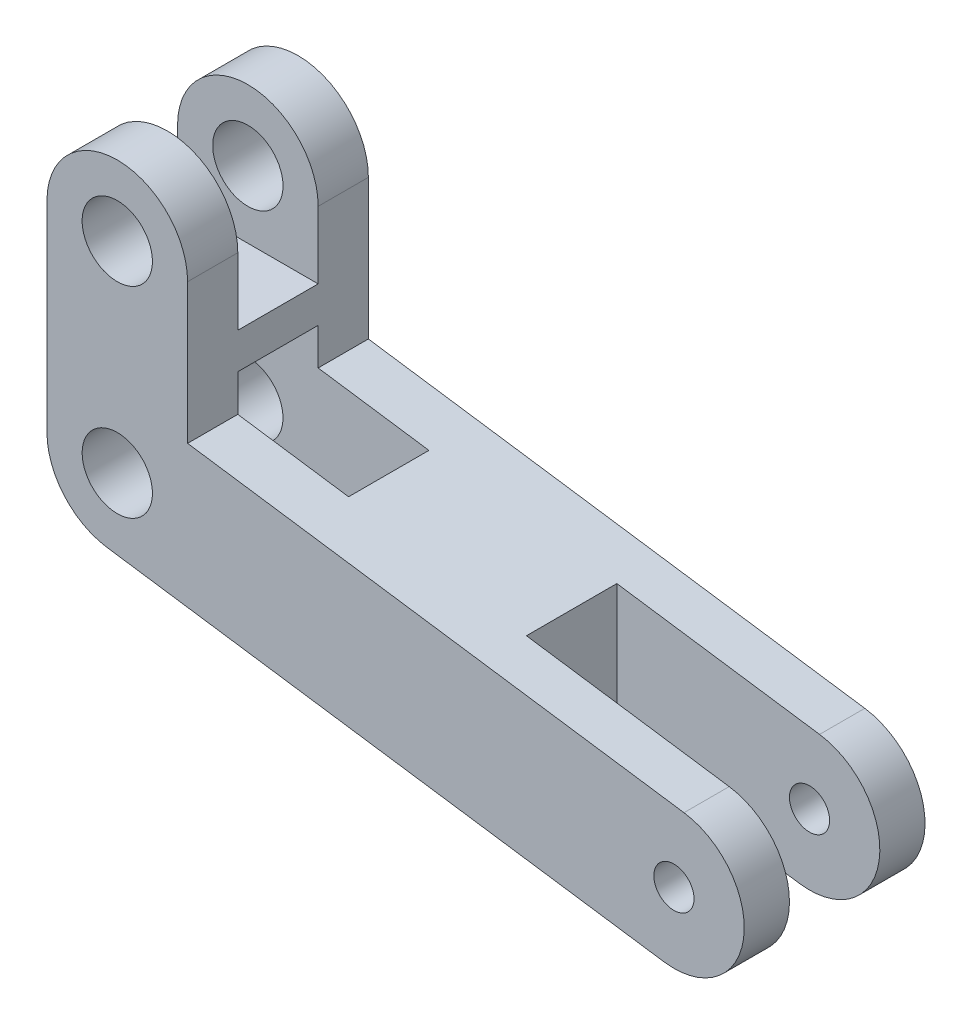
ISO-10303-21;
HEADER;
FILE_DESCRIPTION(('STEP AP214'),'2;1');
FILE_NAME('part.step','',(''),(''),'','','');
FILE_SCHEMA(('AUTOMOTIVE_DESIGN { 1 0 10303 214 1 1 1 1 }'));
ENDSEC;
DATA;
#1=APPLICATION_CONTEXT('core data for automotive mechanical design processes');
#2=APPLICATION_PROTOCOL_DEFINITION('international standard','automotive_design',2000,#1);
#3=PRODUCT_CONTEXT('',#1,'mechanical');
#4=PRODUCT('Part','Part','',(#3));
#5=PRODUCT_RELATED_PRODUCT_CATEGORY('part','',(#4));
#6=PRODUCT_DEFINITION_FORMATION('','',#4);
#7=PRODUCT_DEFINITION_CONTEXT('part definition',#1,'design');
#8=PRODUCT_DEFINITION('design','',#6,#7);
#9=PRODUCT_DEFINITION_SHAPE('','',#8);
#10=(LENGTH_UNIT() NAMED_UNIT(*) SI_UNIT(.MILLI.,.METRE.));
#11=(NAMED_UNIT(*) PLANE_ANGLE_UNIT() SI_UNIT($,.RADIAN.));
#12=(NAMED_UNIT(*) SI_UNIT($,.STERADIAN.) SOLID_ANGLE_UNIT());
#13=UNCERTAINTY_MEASURE_WITH_UNIT(LENGTH_MEASURE(1.E-05),#10,'distance_accuracy_value','');
#14=(GEOMETRIC_REPRESENTATION_CONTEXT(3) GLOBAL_UNCERTAINTY_ASSIGNED_CONTEXT((#13)) GLOBAL_UNIT_ASSIGNED_CONTEXT((#10,
#11,#12)) REPRESENTATION_CONTEXT('',''));
#15=CARTESIAN_POINT('',(0.,0.,0.));
#16=DIRECTION('',(0.,0.,1.));
#17=DIRECTION('',(1.,0.,0.));
#18=AXIS2_PLACEMENT_3D('',#15,#16,#17);
#19=CARTESIAN_POINT('',(27.712812921102,-4.,4.5));
#20=DIRECTION('',(0.,0.,-1.));
#21=DIRECTION('',(-1.,0.,0.));
#22=AXIS2_PLACEMENT_3D('',#19,#20,#21);
#23=CYLINDRICAL_SURFACE('',#22,3.5);
#24=CARTESIAN_POINT('',(27.712812921102,-4.,-2.25));
#25=DIRECTION('',(0.,0.,1.));
#26=DIRECTION('',(1.,0.,0.));
#27=AXIS2_PLACEMENT_3D('',#24,#25,#26);
#28=CIRCLE('',#27,3.5);
#29=CARTESIAN_POINT('',(27.212812921102,-7.46410161513776,-2.25));
#30=VERTEX_POINT('',#29);
#31=CARTESIAN_POINT('',(28.212812921102,-0.535898384862245,-2.25));
#32=VERTEX_POINT('',#31);
#33=EDGE_CURVE('E219',#30,#32,#28,.T.);
#34=ORIENTED_EDGE('',*,*,#33,.F.);
#35=DIRECTION('',(0.,0.,-1.));
#36=VECTOR('',#35,1.);
#37=CARTESIAN_POINT('',(27.212812921102,-7.46410161513776,4.5));
#38=LINE('',#37,#36);
#39=CARTESIAN_POINT('',(27.212812921102,-7.46410161513776,-4.5));
#40=VERTEX_POINT('',#39);
#41=EDGE_CURVE('E323',#30,#40,#38,.T.);
#42=ORIENTED_EDGE('',*,*,#41,.T.);
#43=CARTESIAN_POINT('',(27.712812921102,-4.,-4.5));
#44=DIRECTION('',(0.,0.,1.));
#45=DIRECTION('',(1.,0.,0.));
#46=AXIS2_PLACEMENT_3D('',#43,#44,#45);
#47=CIRCLE('',#46,3.5);
#48=CARTESIAN_POINT('',(28.212812921102,-0.535898384862245,-4.5));
#49=VERTEX_POINT('',#48);
#50=EDGE_CURVE('E304',#40,#49,#47,.T.);
#51=ORIENTED_EDGE('',*,*,#50,.T.);
#52=DIRECTION('',(0.,0.,-1.));
#53=VECTOR('',#52,1.);
#54=CARTESIAN_POINT('',(28.212812921102,-0.535898384862245,4.5));
#55=LINE('',#54,#53);
#56=EDGE_CURVE('E366',#32,#49,#55,.T.);
#57=ORIENTED_EDGE('',*,*,#56,.F.);
#58=EDGE_LOOP('',(#34,#42,#51,#57));
#59=FACE_BOUND('',#58,.T.);
#60=ADVANCED_FACE('F41',(#59),#23,.T.);
#61=CARTESIAN_POINT('',(28.212812921102,-0.535898384862245,4.5));
#62=DIRECTION('',(-0.142857142857143,-0.989743318610787,0.));
#63=DIRECTION('',(0.989743318610787,-0.142857142857143,0.));
#64=AXIS2_PLACEMENT_3D('',#61,#62,#63);
#65=PLANE('',#64);
#66=DIRECTION('',(-0.989743318610787,0.142857142857143,0.));
#67=VECTOR('',#66,1.);
#68=CARTESIAN_POINT('',(28.212812921102,-0.535898384862245,-2.25));
#69=LINE('',#68,#67);
#70=CARTESIAN_POINT('',(18.1194036640366,0.920959753039698,-2.25));
#71=VERTEX_POINT('',#70);
#72=EDGE_CURVE('E201',#32,#71,#69,.T.);
#73=ORIENTED_EDGE('',*,*,#72,.F.);
#74=ORIENTED_EDGE('',*,*,#56,.T.);
#75=DIRECTION('',(-0.989743318610787,0.142857142857143,0.));
#76=VECTOR('',#75,1.);
#77=CARTESIAN_POINT('',(28.212812921102,-0.535898384862245,-4.5));
#78=LINE('',#77,#76);
#79=CARTESIAN_POINT('',(3.5,3.03108891324554,-4.5));
#80=VERTEX_POINT('',#79);
#81=EDGE_CURVE('E326',#49,#80,#78,.T.);
#82=ORIENTED_EDGE('',*,*,#81,.T.);
#83=DIRECTION('',(0.,0.,-1.));
#84=VECTOR('',#83,1.);
#85=CARTESIAN_POINT('',(3.5,3.03108891324554,4.5));
#86=LINE('',#85,#84);
#87=CARTESIAN_POINT('',(3.5,3.03108891324554,-2.));
#88=VERTEX_POINT('',#87);
#89=EDGE_CURVE('E362',#88,#80,#86,.T.);
#90=ORIENTED_EDGE('',*,*,#89,.F.);
#91=DIRECTION('',(0.989743318610787,-0.142857142857143,0.));
#92=VECTOR('',#91,1.);
#93=CARTESIAN_POINT('',(28.212812921102,-0.535898384862245,-2.));
#94=LINE('',#93,#92);
#95=CARTESIAN_POINT('',(9.01483292771079,2.23509134440813,-2.));
#96=VERTEX_POINT('',#95);
#97=EDGE_CURVE('E279',#88,#96,#94,.T.);
#98=ORIENTED_EDGE('',*,*,#97,.T.);
#99=DIRECTION('',(0.,0.,1.));
#100=VECTOR('',#99,1.);
#101=CARTESIAN_POINT('',(9.01483292771079,2.23509134440813,4.5));
#102=LINE('',#101,#100);
#103=CARTESIAN_POINT('',(9.01483292771079,2.23509134440813,2.));
#104=VERTEX_POINT('',#103);
#105=EDGE_CURVE('E282',#96,#104,#102,.T.);
#106=ORIENTED_EDGE('',*,*,#105,.T.);
#107=DIRECTION('',(0.989743318610787,-0.142857142857143,0.));
#108=VECTOR('',#107,1.);
#109=CARTESIAN_POINT('',(28.212812921102,-0.535898384862245,2.));
#110=LINE('',#109,#108);
#111=CARTESIAN_POINT('',(3.5,3.03108891324554,2.));
#112=VERTEX_POINT('',#111);
#113=EDGE_CURVE('E264',#112,#104,#110,.T.);
#114=ORIENTED_EDGE('',*,*,#113,.F.);
#115=CARTESIAN_POINT('',(3.5,3.03108891324554,4.5));
#116=VERTEX_POINT('',#115);
#117=EDGE_CURVE('E363',#116,#112,#86,.T.);
#118=ORIENTED_EDGE('',*,*,#117,.F.);
#119=DIRECTION('',(-0.989743318610787,0.142857142857143,0.));
#120=VECTOR('',#119,1.);
#121=CARTESIAN_POINT('',(28.212812921102,-0.535898384862245,4.5));
#122=LINE('',#121,#120);
#123=CARTESIAN_POINT('',(28.212812921102,-0.535898384862245,4.5));
#124=VERTEX_POINT('',#123);
#125=EDGE_CURVE('E310',#124,#116,#122,.T.);
#126=ORIENTED_EDGE('',*,*,#125,.F.);
#127=CARTESIAN_POINT('',(28.212812921102,-0.535898384862245,2.25));
#128=VERTEX_POINT('',#127);
#129=EDGE_CURVE('E210',#124,#128,#55,.T.);
#130=ORIENTED_EDGE('',*,*,#129,.T.);
#131=DIRECTION('',(-0.989743318610787,0.142857142857143,0.));
#132=VECTOR('',#131,1.);
#133=CARTESIAN_POINT('',(28.212812921102,-0.535898384862245,2.25));
#134=LINE('',#133,#132);
#135=CARTESIAN_POINT('',(18.1194036640366,0.920959753039698,2.25));
#136=VERTEX_POINT('',#135);
#137=EDGE_CURVE('E204',#128,#136,#134,.T.);
#138=ORIENTED_EDGE('',*,*,#137,.T.);
#139=DIRECTION('',(0.,0.,-1.));
#140=VECTOR('',#139,1.);
#141=CARTESIAN_POINT('',(18.1194036640366,0.920959753039699,4.5));
#142=LINE('',#141,#140);
#143=EDGE_CURVE('E191',#136,#71,#142,.T.);
#144=ORIENTED_EDGE('',*,*,#143,.T.);
#145=EDGE_LOOP('',(#73,#74,#82,#90,#98,#106,#114,#118,#126,#130,#138,#144));
#146=FACE_BOUND('',#145,.T.);
#147=ADVANCED_FACE('F208',(#146),#65,.F.);
#148=CARTESIAN_POINT('',(27.212812921102,-7.46410161513776,4.5));
#149=DIRECTION('',(0.142857142857143,0.989743318610787,0.));
#150=DIRECTION('',(-0.989743318610787,0.142857142857143,0.));
#151=AXIS2_PLACEMENT_3D('',#148,#149,#150);
#152=PLANE('',#151);
#153=DIRECTION('',(0.989743318610787,-0.142857142857143,0.));
#154=VECTOR('',#153,1.);
#155=CARTESIAN_POINT('',(27.212812921102,-7.46410161513776,-2.25));
#156=LINE('',#155,#154);
#157=CARTESIAN_POINT('',(18.1194036640366,-6.15158104453322,-2.25));
#158=VERTEX_POINT('',#157);
#159=EDGE_CURVE('E214',#158,#30,#156,.T.);
#160=ORIENTED_EDGE('',*,*,#159,.F.);
#161=DIRECTION('',(0.,0.,1.));
#162=VECTOR('',#161,1.);
#163=CARTESIAN_POINT('',(18.1194036640366,-6.15158104453322,4.5));
#164=LINE('',#163,#162);
#165=CARTESIAN_POINT('',(18.1194036640366,-6.15158104453322,2.25));
#166=VERTEX_POINT('',#165);
#167=EDGE_CURVE('E11',#158,#166,#164,.T.);
#168=ORIENTED_EDGE('',*,*,#167,.T.);
#169=DIRECTION('',(0.989743318610787,-0.142857142857143,0.));
#170=VECTOR('',#169,1.);
#171=CARTESIAN_POINT('',(27.212812921102,-7.46410161513776,2.25));
#172=LINE('',#171,#170);
#173=CARTESIAN_POINT('',(27.212812921102,-7.46410161513776,2.25));
#174=VERTEX_POINT('',#173);
#175=EDGE_CURVE('E205',#166,#174,#172,.T.);
#176=ORIENTED_EDGE('',*,*,#175,.T.);
#177=CARTESIAN_POINT('',(27.212812921102,-7.46410161513776,4.5));
#178=VERTEX_POINT('',#177);
#179=EDGE_CURVE('E343',#178,#174,#38,.T.);
#180=ORIENTED_EDGE('',*,*,#179,.F.);
#181=DIRECTION('',(0.989743318610787,-0.142857142857143,0.));
#182=VECTOR('',#181,1.);
#183=CARTESIAN_POINT('',(27.212812921102,-7.46410161513776,4.5));
#184=LINE('',#183,#182);
#185=CARTESIAN_POINT('',(-0.5,-3.46410161513775,4.5));
#186=VERTEX_POINT('',#185);
#187=EDGE_CURVE('E321',#186,#178,#184,.T.);
#188=ORIENTED_EDGE('',*,*,#187,.F.);
#189=DIRECTION('',(0.,0.,-1.));
#190=VECTOR('',#189,1.);
#191=CARTESIAN_POINT('',(-0.5,-3.46410161513775,4.5));
#192=LINE('',#191,#190);
#193=CARTESIAN_POINT('',(-0.5,-3.46410161513775,2.));
#194=VERTEX_POINT('',#193);
#195=EDGE_CURVE('E347',#186,#194,#192,.T.);
#196=ORIENTED_EDGE('',*,*,#195,.T.);
#197=DIRECTION('',(-0.989743318610787,0.142857142857143,0.));
#198=VECTOR('',#197,1.);
#199=CARTESIAN_POINT('',(27.212812921102,-7.46410161513776,2.));
#200=LINE('',#199,#198);
#201=CARTESIAN_POINT('',(9.01483292771079,-4.83744945316479,2.));
#202=VERTEX_POINT('',#201);
#203=EDGE_CURVE('E256',#202,#194,#200,.T.);
#204=ORIENTED_EDGE('',*,*,#203,.F.);
#205=DIRECTION('',(0.,0.,-1.));
#206=VECTOR('',#205,1.);
#207=CARTESIAN_POINT('',(9.01483292771079,-4.83744945316479,4.5));
#208=LINE('',#207,#206);
#209=CARTESIAN_POINT('',(9.01483292771079,-4.83744945316479,-2.));
#210=VERTEX_POINT('',#209);
#211=EDGE_CURVE('E368',#202,#210,#208,.T.);
#212=ORIENTED_EDGE('',*,*,#211,.T.);
#213=DIRECTION('',(-0.989743318610787,0.142857142857143,0.));
#214=VECTOR('',#213,1.);
#215=CARTESIAN_POINT('',(27.212812921102,-7.46410161513776,-2.));
#216=LINE('',#215,#214);
#217=CARTESIAN_POINT('',(-0.5,-3.46410161513775,-2.));
#218=VERTEX_POINT('',#217);
#219=EDGE_CURVE('E267',#210,#218,#216,.T.);
#220=ORIENTED_EDGE('',*,*,#219,.T.);
#221=CARTESIAN_POINT('',(-0.5,-3.46410161513775,-4.5));
#222=VERTEX_POINT('',#221);
#223=EDGE_CURVE('E346',#218,#222,#192,.T.);
#224=ORIENTED_EDGE('',*,*,#223,.T.);
#225=DIRECTION('',(0.989743318610787,-0.142857142857143,0.));
#226=VECTOR('',#225,1.);
#227=CARTESIAN_POINT('',(27.212812921102,-7.46410161513776,-4.5));
#228=LINE('',#227,#226);
#229=EDGE_CURVE('E311',#222,#40,#228,.T.);
#230=ORIENTED_EDGE('',*,*,#229,.T.);
#231=ORIENTED_EDGE('',*,*,#41,.F.);
#232=EDGE_LOOP('',(#160,#168,#176,#180,#188,#196,#204,#212,#220,#224,#230,#231));
#233=FACE_BOUND('',#232,.T.);
#234=ADVANCED_FACE('F395',(#233),#152,.F.);
#235=CARTESIAN_POINT('',(27.712812921102,-4.,4.5));
#236=DIRECTION('',(0.,0.,-1.));
#237=DIRECTION('',(-1.,0.,0.));
#238=AXIS2_PLACEMENT_3D('',#235,#236,#237);
#239=CYLINDRICAL_SURFACE('',#238,0.999999999999998);
#240=CARTESIAN_POINT('',(27.712812921102,-4.,-4.5));
#241=DIRECTION('',(0.,0.,1.));
#242=DIRECTION('',(1.,0.,0.));
#243=AXIS2_PLACEMENT_3D('',#240,#241,#242);
#244=CIRCLE('',#243,0.999999999999998);
#245=CARTESIAN_POINT('',(28.712812921102,-4.,-4.5));
#246=VERTEX_POINT('',#245);
#247=EDGE_CURVE('E292',#246,#246,#244,.T.);
#248=ORIENTED_EDGE('',*,*,#247,.F.);
#249=EDGE_LOOP('',(#248));
#250=FACE_BOUND('',#249,.T.);
#251=CARTESIAN_POINT('',(27.712812921102,-4.,-2.25));
#252=DIRECTION('',(0.,0.,1.));
#253=DIRECTION('',(1.,0.,0.));
#254=AXIS2_PLACEMENT_3D('',#251,#252,#253);
#255=CIRCLE('',#254,0.999999999999998);
#256=CARTESIAN_POINT('',(28.712812921102,-4.,-2.25));
#257=VERTEX_POINT('',#256);
#258=EDGE_CURVE('E211',#257,#257,#255,.T.);
#259=ORIENTED_EDGE('',*,*,#258,.T.);
#260=EDGE_LOOP('',(#259));
#261=FACE_BOUND('',#260,.T.);
#262=ADVANCED_FACE('F470',(#250,#261),#239,.F.);
#263=CARTESIAN_POINT('',(3.5,10.,4.5));
#264=DIRECTION('',(-1.,0.,0.));
#265=DIRECTION('',(0.,-1.,0.));
#266=AXIS2_PLACEMENT_3D('',#263,#264,#265);
#267=PLANE('',#266);
#268=DIRECTION('',(0.,1.,0.));
#269=VECTOR('',#268,1.);
#270=CARTESIAN_POINT('',(3.5,16.4698635435501,-2.));
#271=LINE('',#270,#269);
#272=CARTESIAN_POINT('',(3.5,6.65669603838257,-2.));
#273=VERTEX_POINT('',#272);
#274=CARTESIAN_POINT('',(3.5,10.,-2.));
#275=VERTEX_POINT('',#274);
#276=EDGE_CURVE('E224',#273,#275,#271,.T.);
#277=ORIENTED_EDGE('',*,*,#276,.F.);
#278=DIRECTION('',(0.,0.,1.));
#279=VECTOR('',#278,1.);
#280=CARTESIAN_POINT('',(3.5,6.65669603838257,-2.));
#281=LINE('',#280,#279);
#282=CARTESIAN_POINT('',(3.5,6.65669603838257,2.));
#283=VERTEX_POINT('',#282);
#284=EDGE_CURVE('E227',#273,#283,#281,.T.);
#285=ORIENTED_EDGE('',*,*,#284,.T.);
#286=DIRECTION('',(0.,1.,0.));
#287=VECTOR('',#286,1.);
#288=CARTESIAN_POINT('',(3.5,16.4698635435501,2.));
#289=LINE('',#288,#287);
#290=CARTESIAN_POINT('',(3.5,10.,2.));
#291=VERTEX_POINT('',#290);
#292=EDGE_CURVE('E225',#283,#291,#289,.T.);
#293=ORIENTED_EDGE('',*,*,#292,.T.);
#294=DIRECTION('',(0.,0.,-1.));
#295=VECTOR('',#294,1.);
#296=CARTESIAN_POINT('',(3.5,10.,4.5));
#297=LINE('',#296,#295);
#298=CARTESIAN_POINT('',(3.5,10.,4.5));
#299=VERTEX_POINT('',#298);
#300=EDGE_CURVE('E359',#299,#291,#297,.T.);
#301=ORIENTED_EDGE('',*,*,#300,.F.);
#302=DIRECTION('',(0.,1.,0.));
#303=VECTOR('',#302,1.);
#304=CARTESIAN_POINT('',(3.5,10.,4.5));
#305=LINE('',#304,#303);
#306=EDGE_CURVE('E313',#116,#299,#305,.T.);
#307=ORIENTED_EDGE('',*,*,#306,.F.);
#308=ORIENTED_EDGE('',*,*,#117,.T.);
#309=DIRECTION('',(0.,-1.,0.));
#310=VECTOR('',#309,1.);
#311=CARTESIAN_POINT('',(3.5,10.,2.));
#312=LINE('',#311,#310);
#313=CARTESIAN_POINT('',(3.5,4.86934920884361,2.));
#314=VERTEX_POINT('',#313);
#315=EDGE_CURVE('E262',#314,#112,#312,.T.);
#316=ORIENTED_EDGE('',*,*,#315,.F.);
#317=DIRECTION('',(0.,0.,-1.));
#318=VECTOR('',#317,1.);
#319=CARTESIAN_POINT('',(3.5,4.86934920884361,4.5));
#320=LINE('',#319,#318);
#321=CARTESIAN_POINT('',(3.5,4.86934920884361,-2.));
#322=VERTEX_POINT('',#321);
#323=EDGE_CURVE('E285',#314,#322,#320,.T.);
#324=ORIENTED_EDGE('',*,*,#323,.T.);
#325=DIRECTION('',(0.,-1.,0.));
#326=VECTOR('',#325,1.);
#327=CARTESIAN_POINT('',(3.5,10.,-2.));
#328=LINE('',#327,#326);
#329=EDGE_CURVE('E276',#322,#88,#328,.T.);
#330=ORIENTED_EDGE('',*,*,#329,.T.);
#331=ORIENTED_EDGE('',*,*,#89,.T.);
#332=DIRECTION('',(0.,1.,0.));
#333=VECTOR('',#332,1.);
#334=CARTESIAN_POINT('',(3.5,10.,-4.5));
#335=LINE('',#334,#333);
#336=CARTESIAN_POINT('',(3.5,10.,-4.5));
#337=VERTEX_POINT('',#336);
#338=EDGE_CURVE('E329',#80,#337,#335,.T.);
#339=ORIENTED_EDGE('',*,*,#338,.T.);
#340=EDGE_CURVE('E358',#275,#337,#297,.T.);
#341=ORIENTED_EDGE('',*,*,#340,.F.);
#342=EDGE_LOOP('',(#277,#285,#293,#301,#307,#308,#316,#324,#330,#331,#339,#341));
#343=FACE_BOUND('',#342,.T.);
#344=ADVANCED_FACE('F411',(#343),#267,.F.);
#345=CARTESIAN_POINT('',(0.,10.,4.5));
#346=DIRECTION('',(0.,0.,-1.));
#347=DIRECTION('',(-1.,0.,0.));
#348=AXIS2_PLACEMENT_3D('',#345,#346,#347);
#349=CYLINDRICAL_SURFACE('',#348,3.5);
#350=CARTESIAN_POINT('',(0.,10.,-2.));
#351=DIRECTION('',(0.,0.,1.));
#352=DIRECTION('',(1.,0.,0.));
#353=AXIS2_PLACEMENT_3D('',#350,#351,#352);
#354=CIRCLE('',#353,3.5);
#355=CARTESIAN_POINT('',(-3.5,10.,-2.));
#356=VERTEX_POINT('',#355);
#357=EDGE_CURVE('E253',#275,#356,#354,.T.);
#358=ORIENTED_EDGE('',*,*,#357,.F.);
#359=ORIENTED_EDGE('',*,*,#340,.T.);
#360=CARTESIAN_POINT('',(0.,10.,-4.5));
#361=DIRECTION('',(0.,0.,1.));
#362=DIRECTION('',(1.,0.,0.));
#363=AXIS2_PLACEMENT_3D('',#360,#361,#362);
#364=CIRCLE('',#363,3.5);
#365=CARTESIAN_POINT('',(-3.5,10.,-4.5));
#366=VERTEX_POINT('',#365);
#367=EDGE_CURVE('E332',#337,#366,#364,.T.);
#368=ORIENTED_EDGE('',*,*,#367,.T.);
#369=DIRECTION('',(0.,0.,-1.));
#370=VECTOR('',#369,1.);
#371=CARTESIAN_POINT('',(-3.5,10.,4.5));
#372=LINE('',#371,#370);
#373=EDGE_CURVE('E354',#356,#366,#372,.T.);
#374=ORIENTED_EDGE('',*,*,#373,.F.);
#375=EDGE_LOOP('',(#358,#359,#368,#374));
#376=FACE_BOUND('',#375,.T.);
#377=ADVANCED_FACE('F459',(#376),#349,.T.);
#378=CARTESIAN_POINT('',(-3.5,10.,4.5));
#379=DIRECTION('',(1.,0.,0.));
#380=DIRECTION('',(0.,1.,0.));
#381=AXIS2_PLACEMENT_3D('',#378,#379,#380);
#382=PLANE('',#381);
#383=DIRECTION('',(0.,-1.,0.));
#384=VECTOR('',#383,1.);
#385=CARTESIAN_POINT('',(-3.5,10.,-2.));
#386=LINE('',#385,#384);
#387=CARTESIAN_POINT('',(-3.5,6.65669603838257,-2.));
#388=VERTEX_POINT('',#387);
#389=EDGE_CURVE('E251',#356,#388,#386,.T.);
#390=ORIENTED_EDGE('',*,*,#389,.F.);
#391=ORIENTED_EDGE('',*,*,#373,.T.);
#392=DIRECTION('',(0.,-1.,0.));
#393=VECTOR('',#392,1.);
#394=CARTESIAN_POINT('',(-3.5,10.,-4.5));
#395=LINE('',#394,#393);
#396=CARTESIAN_POINT('',(-3.5,0.,-4.5));
#397=VERTEX_POINT('',#396);
#398=EDGE_CURVE('E335',#366,#397,#395,.T.);
#399=ORIENTED_EDGE('',*,*,#398,.T.);
#400=DIRECTION('',(0.,0.,-1.));
#401=VECTOR('',#400,1.);
#402=CARTESIAN_POINT('',(-3.5,0.,4.5));
#403=LINE('',#402,#401);
#404=CARTESIAN_POINT('',(-3.5,0.,-2.));
#405=VERTEX_POINT('',#404);
#406=EDGE_CURVE('E350',#405,#397,#403,.T.);
#407=ORIENTED_EDGE('',*,*,#406,.F.);
#408=DIRECTION('',(0.,1.,0.));
#409=VECTOR('',#408,1.);
#410=CARTESIAN_POINT('',(-3.5,10.,-2.));
#411=LINE('',#410,#409);
#412=CARTESIAN_POINT('',(-3.5,4.86934920884361,-2.));
#413=VERTEX_POINT('',#412);
#414=EDGE_CURVE('E273',#405,#413,#411,.T.);
#415=ORIENTED_EDGE('',*,*,#414,.T.);
#416=DIRECTION('',(0.,0.,1.));
#417=VECTOR('',#416,1.);
#418=CARTESIAN_POINT('',(-3.5,4.86934920884361,4.5));
#419=LINE('',#418,#417);
#420=CARTESIAN_POINT('',(-3.5,4.86934920884361,2.));
#421=VERTEX_POINT('',#420);
#422=EDGE_CURVE('E379',#413,#421,#419,.T.);
#423=ORIENTED_EDGE('',*,*,#422,.T.);
#424=DIRECTION('',(0.,1.,0.));
#425=VECTOR('',#424,1.);
#426=CARTESIAN_POINT('',(-3.5,10.,2.));
#427=LINE('',#426,#425);
#428=CARTESIAN_POINT('',(-3.5,0.,2.));
#429=VERTEX_POINT('',#428);
#430=EDGE_CURVE('E260',#429,#421,#427,.T.);
#431=ORIENTED_EDGE('',*,*,#430,.F.);
#432=CARTESIAN_POINT('',(-3.5,0.,4.5));
#433=VERTEX_POINT('',#432);
#434=EDGE_CURVE('E351',#433,#429,#403,.T.);
#435=ORIENTED_EDGE('',*,*,#434,.F.);
#436=DIRECTION('',(0.,-1.,0.));
#437=VECTOR('',#436,1.);
#438=CARTESIAN_POINT('',(-3.5,10.,4.5));
#439=LINE('',#438,#437);
#440=CARTESIAN_POINT('',(-3.5,10.,4.5));
#441=VERTEX_POINT('',#440);
#442=EDGE_CURVE('E317',#441,#433,#439,.T.);
#443=ORIENTED_EDGE('',*,*,#442,.F.);
#444=CARTESIAN_POINT('',(-3.5,10.,2.));
#445=VERTEX_POINT('',#444);
#446=EDGE_CURVE('E355',#441,#445,#372,.T.);
#447=ORIENTED_EDGE('',*,*,#446,.T.);
#448=DIRECTION('',(0.,-1.,0.));
#449=VECTOR('',#448,1.);
#450=CARTESIAN_POINT('',(-3.5,10.,2.));
#451=LINE('',#450,#449);
#452=CARTESIAN_POINT('',(-3.5,6.65669603838257,2.));
#453=VERTEX_POINT('',#452);
#454=EDGE_CURVE('E244',#445,#453,#451,.T.);
#455=ORIENTED_EDGE('',*,*,#454,.T.);
#456=DIRECTION('',(0.,0.,-1.));
#457=VECTOR('',#456,1.);
#458=CARTESIAN_POINT('',(-3.5,6.65669603838257,4.5));
#459=LINE('',#458,#457);
#460=EDGE_CURVE('E49',#453,#388,#459,.T.);
#461=ORIENTED_EDGE('',*,*,#460,.T.);
#462=EDGE_LOOP('',(#390,#391,#399,#407,#415,#423,#431,#435,#443,#447,#455,#461));
#463=FACE_BOUND('',#462,.T.);
#464=ADVANCED_FACE('F434',(#463),#382,.F.);
#465=CARTESIAN_POINT('',(0.,0.,4.5));
#466=DIRECTION('',(0.,0.,-1.));
#467=DIRECTION('',(-1.,0.,0.));
#468=AXIS2_PLACEMENT_3D('',#465,#466,#467);
#469=CYLINDRICAL_SURFACE('',#468,3.5);
#470=CARTESIAN_POINT('',(0.,0.,2.));
#471=DIRECTION('',(0.,0.,-1.));
#472=DIRECTION('',(-1.,0.,0.));
#473=AXIS2_PLACEMENT_3D('',#470,#471,#472);
#474=CIRCLE('',#473,3.5);
#475=EDGE_CURVE('E258',#194,#429,#474,.T.);
#476=ORIENTED_EDGE('',*,*,#475,.F.);
#477=ORIENTED_EDGE('',*,*,#195,.F.);
#478=CARTESIAN_POINT('',(0.,0.,4.5));
#479=DIRECTION('',(0.,0.,1.));
#480=DIRECTION('',(1.,0.,0.));
#481=AXIS2_PLACEMENT_3D('',#478,#479,#480);
#482=CIRCLE('',#481,3.5);
#483=EDGE_CURVE('E319',#433,#186,#482,.T.);
#484=ORIENTED_EDGE('',*,*,#483,.F.);
#485=ORIENTED_EDGE('',*,*,#434,.T.);
#486=EDGE_LOOP('',(#476,#477,#484,#485));
#487=FACE_BOUND('',#486,.T.);
#488=ADVANCED_FACE('F428',(#487),#469,.T.);
#489=CARTESIAN_POINT('',(0.,0.,4.5));
#490=DIRECTION('',(0.,0.,-1.));
#491=DIRECTION('',(-1.,0.,0.));
#492=AXIS2_PLACEMENT_3D('',#489,#490,#491);
#493=CYLINDRICAL_SURFACE('',#492,1.75);
#494=CARTESIAN_POINT('',(0.,0.,4.5));
#495=DIRECTION('',(0.,0.,1.));
#496=DIRECTION('',(1.,0.,0.));
#497=AXIS2_PLACEMENT_3D('',#494,#495,#496);
#498=CIRCLE('',#497,1.75);
#499=CARTESIAN_POINT('',(1.75,0.,4.5));
#500=VERTEX_POINT('',#499);
#501=EDGE_CURVE('E301',#500,#500,#498,.T.);
#502=ORIENTED_EDGE('',*,*,#501,.T.);
#503=EDGE_LOOP('',(#502));
#504=FACE_BOUND('',#503,.T.);
#505=CARTESIAN_POINT('',(0.,0.,2.));
#506=DIRECTION('',(0.,0.,-1.));
#507=DIRECTION('',(-1.,0.,0.));
#508=AXIS2_PLACEMENT_3D('',#505,#506,#507);
#509=CIRCLE('',#508,1.75);
#510=CARTESIAN_POINT('',(-1.75,0.,2.));
#511=VERTEX_POINT('',#510);
#512=EDGE_CURVE('E255',#511,#511,#509,.T.);
#513=ORIENTED_EDGE('',*,*,#512,.T.);
#514=EDGE_LOOP('',(#513));
#515=FACE_BOUND('',#514,.T.);
#516=ADVANCED_FACE('F489',(#504,#515),#493,.F.);
#517=CARTESIAN_POINT('',(0.,10.,4.5));
#518=DIRECTION('',(0.,0.,-1.));
#519=DIRECTION('',(-1.,0.,0.));
#520=AXIS2_PLACEMENT_3D('',#517,#518,#519);
#521=CYLINDRICAL_SURFACE('',#520,1.75);
#522=CARTESIAN_POINT('',(0.,10.,-4.5));
#523=DIRECTION('',(0.,0.,1.));
#524=DIRECTION('',(1.,0.,0.));
#525=AXIS2_PLACEMENT_3D('',#522,#523,#524);
#526=CIRCLE('',#525,1.75);
#527=CARTESIAN_POINT('',(1.75,10.,-4.5));
#528=VERTEX_POINT('',#527);
#529=EDGE_CURVE('E288',#528,#528,#526,.T.);
#530=ORIENTED_EDGE('',*,*,#529,.F.);
#531=EDGE_LOOP('',(#530));
#532=FACE_BOUND('',#531,.T.);
#533=CARTESIAN_POINT('',(0.,10.,-2.));
#534=DIRECTION('',(0.,0.,1.));
#535=DIRECTION('',(1.,0.,0.));
#536=AXIS2_PLACEMENT_3D('',#533,#534,#535);
#537=CIRCLE('',#536,1.75);
#538=CARTESIAN_POINT('',(1.75,10.,-2.));
#539=VERTEX_POINT('',#538);
#540=EDGE_CURVE('E250',#539,#539,#537,.T.);
#541=ORIENTED_EDGE('',*,*,#540,.T.);
#542=EDGE_LOOP('',(#541));
#543=FACE_BOUND('',#542,.T.);
#544=ADVANCED_FACE('F483',(#532,#543),#521,.F.);
#545=CARTESIAN_POINT('',(27.712812921102,-4.,4.5));
#546=DIRECTION('',(0.,0.,1.));
#547=DIRECTION('',(1.,0.,0.));
#548=AXIS2_PLACEMENT_3D('',#545,#546,#547);
#549=PLANE('',#548);
#550=CARTESIAN_POINT('',(27.712812921102,-4.,4.5));
#551=DIRECTION('',(0.,0.,1.));
#552=DIRECTION('',(1.,0.,0.));
#553=AXIS2_PLACEMENT_3D('',#550,#551,#552);
#554=CIRCLE('',#553,0.999999999999998);
#555=CARTESIAN_POINT('',(28.712812921102,-4.,4.5));
#556=VERTEX_POINT('',#555);
#557=EDGE_CURVE('E295',#556,#556,#554,.T.);
#558=ORIENTED_EDGE('',*,*,#557,.F.);
#559=EDGE_LOOP('',(#558));
#560=FACE_BOUND('',#559,.T.);
#561=CARTESIAN_POINT('',(27.712812921102,-4.,4.5));
#562=DIRECTION('',(0.,0.,1.));
#563=DIRECTION('',(1.,0.,0.));
#564=AXIS2_PLACEMENT_3D('',#561,#562,#563);
#565=CIRCLE('',#564,3.5);
#566=EDGE_CURVE('E307',#178,#124,#565,.T.);
#567=ORIENTED_EDGE('',*,*,#566,.T.);
#568=ORIENTED_EDGE('',*,*,#125,.T.);
#569=ORIENTED_EDGE('',*,*,#306,.T.);
#570=CARTESIAN_POINT('',(0.,10.,4.5));
#571=DIRECTION('',(0.,0.,1.));
#572=DIRECTION('',(1.,0.,0.));
#573=AXIS2_PLACEMENT_3D('',#570,#571,#572);
#574=CIRCLE('',#573,3.5);
#575=EDGE_CURVE('E315',#299,#441,#574,.T.);
#576=ORIENTED_EDGE('',*,*,#575,.T.);
#577=ORIENTED_EDGE('',*,*,#442,.T.);
#578=ORIENTED_EDGE('',*,*,#483,.T.);
#579=ORIENTED_EDGE('',*,*,#187,.T.);
#580=EDGE_LOOP('',(#567,#568,#569,#576,#577,#578,#579));
#581=FACE_BOUND('',#580,.T.);
#582=ORIENTED_EDGE('',*,*,#501,.F.);
#583=EDGE_LOOP('',(#582));
#584=FACE_BOUND('',#583,.T.);
#585=CARTESIAN_POINT('',(0.,10.,4.5));
#586=DIRECTION('',(0.,0.,1.));
#587=DIRECTION('',(1.,0.,0.));
#588=AXIS2_PLACEMENT_3D('',#585,#586,#587);
#589=CIRCLE('',#588,1.75);
#590=CARTESIAN_POINT('',(1.75,10.,4.5));
#591=VERTEX_POINT('',#590);
#592=EDGE_CURVE('E289',#591,#591,#589,.T.);
#593=ORIENTED_EDGE('',*,*,#592,.F.);
#594=EDGE_LOOP('',(#593));
#595=FACE_BOUND('',#594,.T.);
#596=ADVANCED_FACE('F443',(#560,#581,#584,#595),#549,.T.);
#597=CARTESIAN_POINT('',(27.712812921102,-4.,-4.5));
#598=DIRECTION('',(0.,0.,1.));
#599=DIRECTION('',(1.,0.,0.));
#600=AXIS2_PLACEMENT_3D('',#597,#598,#599);
#601=PLANE('',#600);
#602=ORIENTED_EDGE('',*,*,#50,.F.);
#603=ORIENTED_EDGE('',*,*,#229,.F.);
#604=CARTESIAN_POINT('',(0.,0.,-4.5));
#605=DIRECTION('',(0.,0.,1.));
#606=DIRECTION('',(1.,0.,0.));
#607=AXIS2_PLACEMENT_3D('',#604,#605,#606);
#608=CIRCLE('',#607,3.5);
#609=EDGE_CURVE('E338',#397,#222,#608,.T.);
#610=ORIENTED_EDGE('',*,*,#609,.F.);
#611=ORIENTED_EDGE('',*,*,#398,.F.);
#612=ORIENTED_EDGE('',*,*,#367,.F.);
#613=ORIENTED_EDGE('',*,*,#338,.F.);
#614=ORIENTED_EDGE('',*,*,#81,.F.);
#615=EDGE_LOOP('',(#602,#603,#610,#611,#612,#613,#614));
#616=FACE_BOUND('',#615,.T.);
#617=CARTESIAN_POINT('',(0.,0.,-4.5));
#618=DIRECTION('',(0.,0.,1.));
#619=DIRECTION('',(1.,0.,0.));
#620=AXIS2_PLACEMENT_3D('',#617,#618,#619);
#621=CIRCLE('',#620,1.75);
#622=CARTESIAN_POINT('',(1.75,0.,-4.5));
#623=VERTEX_POINT('',#622);
#624=EDGE_CURVE('E298',#623,#623,#621,.T.);
#625=ORIENTED_EDGE('',*,*,#624,.T.);
#626=EDGE_LOOP('',(#625));
#627=FACE_BOUND('',#626,.T.);
#628=ORIENTED_EDGE('',*,*,#247,.T.);
#629=EDGE_LOOP('',(#628));
#630=FACE_BOUND('',#629,.T.);
#631=ORIENTED_EDGE('',*,*,#529,.T.);
#632=EDGE_LOOP('',(#631));
#633=FACE_BOUND('',#632,.T.);
#634=ADVANCED_FACE('F404',(#616,#627,#630,#633),#601,.F.);
#635=ORIENTED_EDGE('',*,*,#179,.T.);
#636=CARTESIAN_POINT('',(27.712812921102,-4.,2.25));
#637=DIRECTION('',(0.,0.,1.));
#638=DIRECTION('',(1.,0.,0.));
#639=AXIS2_PLACEMENT_3D('',#636,#637,#638);
#640=CIRCLE('',#639,3.5);
#641=EDGE_CURVE('E56',#174,#128,#640,.T.);
#642=ORIENTED_EDGE('',*,*,#641,.T.);
#643=ORIENTED_EDGE('',*,*,#129,.F.);
#644=ORIENTED_EDGE('',*,*,#566,.F.);
#645=EDGE_LOOP('',(#635,#642,#643,#644));
#646=FACE_BOUND('',#645,.T.);
#647=ADVANCED_FACE('F43',(#646),#23,.T.);
#648=ORIENTED_EDGE('',*,*,#300,.T.);
#649=CARTESIAN_POINT('',(0.,10.,2.));
#650=DIRECTION('',(0.,0.,1.));
#651=DIRECTION('',(1.,0.,0.));
#652=AXIS2_PLACEMENT_3D('',#649,#650,#651);
#653=CIRCLE('',#652,3.5);
#654=EDGE_CURVE('E247',#291,#445,#653,.T.);
#655=ORIENTED_EDGE('',*,*,#654,.T.);
#656=ORIENTED_EDGE('',*,*,#446,.F.);
#657=ORIENTED_EDGE('',*,*,#575,.F.);
#658=EDGE_LOOP('',(#648,#655,#656,#657));
#659=FACE_BOUND('',#658,.T.);
#660=ADVANCED_FACE('F450',(#659),#349,.T.);
#661=ORIENTED_EDGE('',*,*,#223,.F.);
#662=CARTESIAN_POINT('',(0.,0.,-2.));
#663=DIRECTION('',(0.,0.,-1.));
#664=DIRECTION('',(-1.,0.,0.));
#665=AXIS2_PLACEMENT_3D('',#662,#663,#664);
#666=CIRCLE('',#665,3.5);
#667=EDGE_CURVE('E270',#218,#405,#666,.T.);
#668=ORIENTED_EDGE('',*,*,#667,.T.);
#669=ORIENTED_EDGE('',*,*,#406,.T.);
#670=ORIENTED_EDGE('',*,*,#609,.T.);
#671=EDGE_LOOP('',(#661,#668,#669,#670));
#672=FACE_BOUND('',#671,.T.);
#673=ADVANCED_FACE('F456',(#672),#469,.T.);
#674=CARTESIAN_POINT('',(0.,0.,-2.));
#675=DIRECTION('',(0.,0.,-1.));
#676=DIRECTION('',(-1.,0.,0.));
#677=AXIS2_PLACEMENT_3D('',#674,#675,#676);
#678=CIRCLE('',#677,1.75);
#679=CARTESIAN_POINT('',(-1.75,0.,-2.));
#680=VERTEX_POINT('',#679);
#681=EDGE_CURVE('E266',#680,#680,#678,.T.);
#682=ORIENTED_EDGE('',*,*,#681,.F.);
#683=EDGE_LOOP('',(#682));
#684=FACE_BOUND('',#683,.T.);
#685=ORIENTED_EDGE('',*,*,#624,.F.);
#686=EDGE_LOOP('',(#685));
#687=FACE_BOUND('',#686,.T.);
#688=ADVANCED_FACE('F478',(#684,#687),#493,.F.);
#689=CARTESIAN_POINT('',(27.712812921102,-4.,2.25));
#690=DIRECTION('',(0.,0.,1.));
#691=DIRECTION('',(1.,0.,0.));
#692=AXIS2_PLACEMENT_3D('',#689,#690,#691);
#693=CIRCLE('',#692,0.999999999999998);
#694=CARTESIAN_POINT('',(28.712812921102,-4.,2.25));
#695=VERTEX_POINT('',#694);
#696=EDGE_CURVE('E384',#695,#695,#693,.T.);
#697=ORIENTED_EDGE('',*,*,#696,.F.);
#698=EDGE_LOOP('',(#697));
#699=FACE_BOUND('',#698,.T.);
#700=ORIENTED_EDGE('',*,*,#557,.T.);
#701=EDGE_LOOP('',(#700));
#702=FACE_BOUND('',#701,.T.);
#703=ADVANCED_FACE('F487',(#699,#702),#239,.F.);
#704=CARTESIAN_POINT('',(0.,10.,2.));
#705=DIRECTION('',(0.,0.,1.));
#706=DIRECTION('',(1.,0.,0.));
#707=AXIS2_PLACEMENT_3D('',#704,#705,#706);
#708=CIRCLE('',#707,1.75);
#709=CARTESIAN_POINT('',(1.75,10.,2.));
#710=VERTEX_POINT('',#709);
#711=EDGE_CURVE('E235',#710,#710,#708,.T.);
#712=ORIENTED_EDGE('',*,*,#711,.F.);
#713=EDGE_LOOP('',(#712));
#714=FACE_BOUND('',#713,.T.);
#715=ORIENTED_EDGE('',*,*,#592,.T.);
#716=EDGE_LOOP('',(#715));
#717=FACE_BOUND('',#716,.T.);
#718=ADVANCED_FACE('F491',(#714,#717),#521,.F.);
#719=CARTESIAN_POINT('',(-5.69968246198156,6.65669603838257,-2.));
#720=DIRECTION('',(0.,-1.,0.));
#721=DIRECTION('',(0.,0.,-1.));
#722=AXIS2_PLACEMENT_3D('',#719,#720,#721);
#723=PLANE('',#722);
#724=DIRECTION('',(1.,0.,0.));
#725=VECTOR('',#724,1.);
#726=CARTESIAN_POINT('',(-5.69968246198156,6.65669603838257,2.));
#727=LINE('',#726,#725);
#728=EDGE_CURVE('E228',#453,#283,#727,.T.);
#729=ORIENTED_EDGE('',*,*,#728,.T.);
#730=ORIENTED_EDGE('',*,*,#284,.F.);
#731=DIRECTION('',(1.,0.,0.));
#732=VECTOR('',#731,1.);
#733=CARTESIAN_POINT('',(-5.69968246198156,6.65669603838257,-2.));
#734=LINE('',#733,#732);
#735=EDGE_CURVE('E222',#388,#273,#734,.T.);
#736=ORIENTED_EDGE('',*,*,#735,.F.);
#737=ORIENTED_EDGE('',*,*,#460,.F.);
#738=EDGE_LOOP('',(#729,#730,#736,#737));
#739=FACE_BOUND('',#738,.T.);
#740=ADVANCED_FACE('F495',(#739),#723,.F.);
#741=CARTESIAN_POINT('',(0.,0.,-2.));
#742=DIRECTION('',(0.,0.,1.));
#743=DIRECTION('',(1.,0.,0.));
#744=AXIS2_PLACEMENT_3D('',#741,#742,#743);
#745=PLANE('',#744);
#746=ORIENTED_EDGE('',*,*,#540,.F.);
#747=EDGE_LOOP('',(#746));
#748=FACE_BOUND('',#747,.T.);
#749=ORIENTED_EDGE('',*,*,#357,.T.);
#750=ORIENTED_EDGE('',*,*,#389,.T.);
#751=ORIENTED_EDGE('',*,*,#735,.T.);
#752=ORIENTED_EDGE('',*,*,#276,.T.);
#753=EDGE_LOOP('',(#749,#750,#751,#752));
#754=FACE_BOUND('',#753,.T.);
#755=ADVANCED_FACE('F509',(#748,#754),#745,.T.);
#756=CARTESIAN_POINT('',(0.,0.,2.));
#757=DIRECTION('',(0.,0.,1.));
#758=DIRECTION('',(1.,0.,0.));
#759=AXIS2_PLACEMENT_3D('',#756,#757,#758);
#760=PLANE('',#759);
#761=ORIENTED_EDGE('',*,*,#711,.T.);
#762=EDGE_LOOP('',(#761));
#763=FACE_BOUND('',#762,.T.);
#764=ORIENTED_EDGE('',*,*,#292,.F.);
#765=ORIENTED_EDGE('',*,*,#728,.F.);
#766=ORIENTED_EDGE('',*,*,#454,.F.);
#767=ORIENTED_EDGE('',*,*,#654,.F.);
#768=EDGE_LOOP('',(#764,#765,#766,#767));
#769=FACE_BOUND('',#768,.T.);
#770=ADVANCED_FACE('F501',(#763,#769),#760,.F.);
#771=CARTESIAN_POINT('',(-5.64552182951993,4.86934920884361,-2.));
#772=DIRECTION('',(0.,1.,0.));
#773=DIRECTION('',(0.,0.,1.));
#774=AXIS2_PLACEMENT_3D('',#771,#772,#773);
#775=PLANE('',#774);
#776=DIRECTION('',(-1.,0.,0.));
#777=VECTOR('',#776,1.);
#778=CARTESIAN_POINT('',(-5.64552182951993,4.86934920884361,2.));
#779=LINE('',#778,#777);
#780=EDGE_CURVE('E64',#314,#421,#779,.T.);
#781=ORIENTED_EDGE('',*,*,#780,.T.);
#782=ORIENTED_EDGE('',*,*,#422,.F.);
#783=DIRECTION('',(-1.,0.,0.));
#784=VECTOR('',#783,1.);
#785=CARTESIAN_POINT('',(-5.64552182951993,4.86934920884361,-2.));
#786=LINE('',#785,#784);
#787=EDGE_CURVE('E230',#322,#413,#786,.T.);
#788=ORIENTED_EDGE('',*,*,#787,.F.);
#789=ORIENTED_EDGE('',*,*,#323,.F.);
#790=EDGE_LOOP('',(#781,#782,#788,#789));
#791=FACE_BOUND('',#790,.T.);
#792=ADVANCED_FACE('F436',(#791),#775,.F.);
#793=CARTESIAN_POINT('',(9.01483292771079,-5.65610443682518,-2.));
#794=DIRECTION('',(1.,0.,0.));
#795=DIRECTION('',(0.,0.,-1.));
#796=AXIS2_PLACEMENT_3D('',#793,#794,#795);
#797=PLANE('',#796);
#798=DIRECTION('',(0.,1.,0.));
#799=VECTOR('',#798,1.);
#800=CARTESIAN_POINT('',(9.01483292771079,-5.65610443682518,-2.));
#801=LINE('',#800,#799);
#802=EDGE_CURVE('E236',#210,#96,#801,.T.);
#803=ORIENTED_EDGE('',*,*,#802,.F.);
#804=ORIENTED_EDGE('',*,*,#211,.F.);
#805=DIRECTION('',(0.,1.,0.));
#806=VECTOR('',#805,1.);
#807=CARTESIAN_POINT('',(9.01483292771079,-5.65610443682518,2.));
#808=LINE('',#807,#806);
#809=EDGE_CURVE('E200',#202,#104,#808,.T.);
#810=ORIENTED_EDGE('',*,*,#809,.T.);
#811=ORIENTED_EDGE('',*,*,#105,.F.);
#812=EDGE_LOOP('',(#803,#804,#810,#811));
#813=FACE_BOUND('',#812,.T.);
#814=ADVANCED_FACE('F419',(#813),#797,.F.);
#815=CARTESIAN_POINT('',(0.,0.,-2.));
#816=DIRECTION('',(0.,0.,-1.));
#817=DIRECTION('',(-1.,0.,0.));
#818=AXIS2_PLACEMENT_3D('',#815,#816,#817);
#819=PLANE('',#818);
#820=ORIENTED_EDGE('',*,*,#681,.T.);
#821=EDGE_LOOP('',(#820));
#822=FACE_BOUND('',#821,.T.);
#823=ORIENTED_EDGE('',*,*,#329,.F.);
#824=ORIENTED_EDGE('',*,*,#787,.T.);
#825=ORIENTED_EDGE('',*,*,#414,.F.);
#826=ORIENTED_EDGE('',*,*,#667,.F.);
#827=ORIENTED_EDGE('',*,*,#219,.F.);
#828=ORIENTED_EDGE('',*,*,#802,.T.);
#829=ORIENTED_EDGE('',*,*,#97,.F.);
#830=EDGE_LOOP('',(#823,#824,#825,#826,#827,#828,#829));
#831=FACE_BOUND('',#830,.T.);
#832=ADVANCED_FACE('F414',(#822,#831),#819,.F.);
#833=CARTESIAN_POINT('',(0.,0.,2.));
#834=DIRECTION('',(0.,0.,-1.));
#835=DIRECTION('',(-1.,0.,0.));
#836=AXIS2_PLACEMENT_3D('',#833,#834,#835);
#837=PLANE('',#836);
#838=ORIENTED_EDGE('',*,*,#512,.F.);
#839=EDGE_LOOP('',(#838));
#840=FACE_BOUND('',#839,.T.);
#841=ORIENTED_EDGE('',*,*,#113,.T.);
#842=ORIENTED_EDGE('',*,*,#809,.F.);
#843=ORIENTED_EDGE('',*,*,#203,.T.);
#844=ORIENTED_EDGE('',*,*,#475,.T.);
#845=ORIENTED_EDGE('',*,*,#430,.T.);
#846=ORIENTED_EDGE('',*,*,#780,.F.);
#847=ORIENTED_EDGE('',*,*,#315,.T.);
#848=EDGE_LOOP('',(#841,#842,#843,#844,#845,#846,#847));
#849=FACE_BOUND('',#848,.T.);
#850=ADVANCED_FACE('F425',(#840,#849),#837,.T.);
#851=CARTESIAN_POINT('',(18.1194036640366,-10.,-2.25));
#852=DIRECTION('',(-1.,0.,0.));
#853=DIRECTION('',(0.,0.,1.));
#854=AXIS2_PLACEMENT_3D('',#851,#852,#853);
#855=PLANE('',#854);
#856=DIRECTION('',(0.,-1.,0.));
#857=VECTOR('',#856,1.);
#858=CARTESIAN_POINT('',(18.1194036640366,-10.,2.25));
#859=LINE('',#858,#857);
#860=EDGE_CURVE('E194',#136,#166,#859,.T.);
#861=ORIENTED_EDGE('',*,*,#860,.T.);
#862=ORIENTED_EDGE('',*,*,#167,.F.);
#863=DIRECTION('',(0.,-1.,0.));
#864=VECTOR('',#863,1.);
#865=CARTESIAN_POINT('',(18.1194036640366,-10.,-2.25));
#866=LINE('',#865,#864);
#867=EDGE_CURVE('E196',#71,#158,#866,.T.);
#868=ORIENTED_EDGE('',*,*,#867,.F.);
#869=ORIENTED_EDGE('',*,*,#143,.F.);
#870=EDGE_LOOP('',(#861,#862,#868,#869));
#871=FACE_BOUND('',#870,.T.);
#872=ADVANCED_FACE('F193',(#871),#855,.F.);
#873=CARTESIAN_POINT('',(0.,0.,-2.25));
#874=DIRECTION('',(0.,0.,1.));
#875=DIRECTION('',(1.,0.,0.));
#876=AXIS2_PLACEMENT_3D('',#873,#874,#875);
#877=PLANE('',#876);
#878=ORIENTED_EDGE('',*,*,#258,.F.);
#879=EDGE_LOOP('',(#878));
#880=FACE_BOUND('',#879,.T.);
#881=ORIENTED_EDGE('',*,*,#72,.T.);
#882=ORIENTED_EDGE('',*,*,#867,.T.);
#883=ORIENTED_EDGE('',*,*,#159,.T.);
#884=ORIENTED_EDGE('',*,*,#33,.T.);
#885=EDGE_LOOP('',(#881,#882,#883,#884));
#886=FACE_BOUND('',#885,.T.);
#887=ADVANCED_FACE('F391',(#880,#886),#877,.T.);
#888=CARTESIAN_POINT('',(0.,0.,2.25));
#889=DIRECTION('',(0.,0.,1.));
#890=DIRECTION('',(1.,0.,0.));
#891=AXIS2_PLACEMENT_3D('',#888,#889,#890);
#892=PLANE('',#891);
#893=ORIENTED_EDGE('',*,*,#696,.T.);
#894=EDGE_LOOP('',(#893));
#895=FACE_BOUND('',#894,.T.);
#896=ORIENTED_EDGE('',*,*,#641,.F.);
#897=ORIENTED_EDGE('',*,*,#175,.F.);
#898=ORIENTED_EDGE('',*,*,#860,.F.);
#899=ORIENTED_EDGE('',*,*,#137,.F.);
#900=EDGE_LOOP('',(#896,#897,#898,#899));
#901=FACE_BOUND('',#900,.T.);
#902=ADVANCED_FACE('F203',(#895,#901),#892,.F.);
#903=CLOSED_SHELL('',(#60,#147,#234,#262,#344,#377,#464,#488,#516,#544,#596,#634,#647,#660,#673,
#688,#703,#718,#740,#755,#770,#792,#814,#832,#850,#872,#887,#902));
#904=MANIFOLD_SOLID_BREP('B2',#903);
#905=ADVANCED_BREP_SHAPE_REPRESENTATION('',(#18,#904),#14);
#906=SHAPE_DEFINITION_REPRESENTATION(#9,#905);
ENDSEC;
END-ISO-10303-21;
